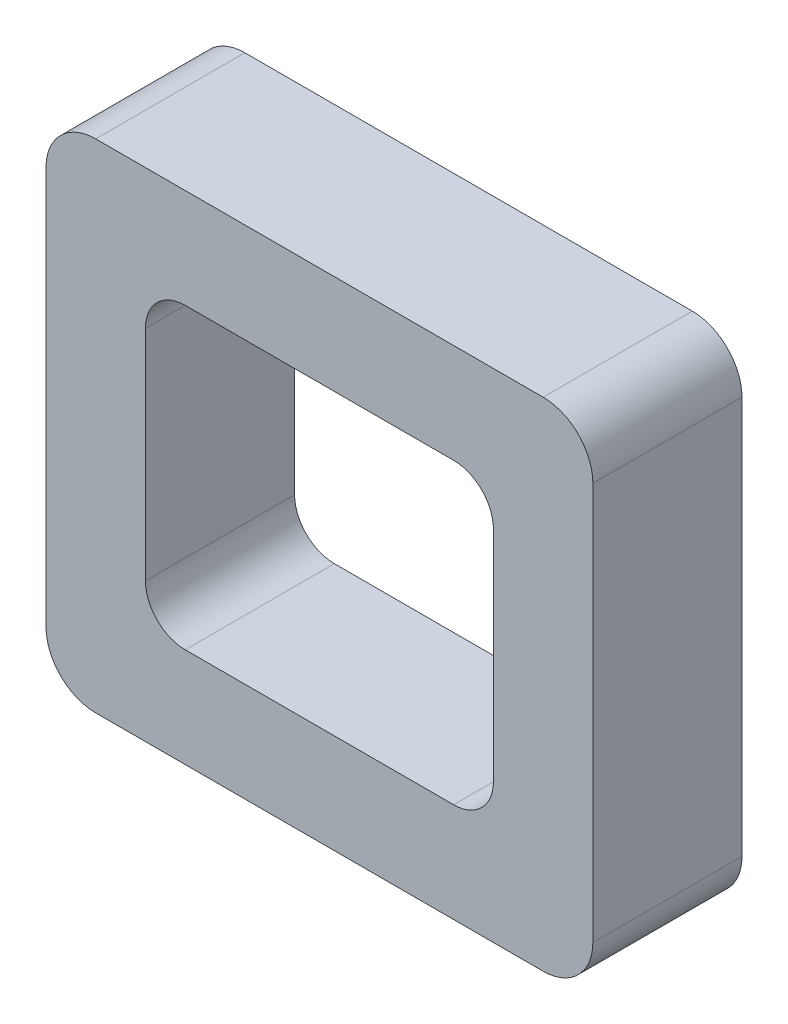
ISO-10303-21;
HEADER;
FILE_DESCRIPTION(('STEP AP214'),'2;1');
FILE_NAME('part.step','',(''),(''),'','','');
FILE_SCHEMA(('AUTOMOTIVE_DESIGN { 1 0 10303 214 1 1 1 1 }'));
ENDSEC;
DATA;
#1=APPLICATION_CONTEXT('core data for automotive mechanical design processes');
#2=APPLICATION_PROTOCOL_DEFINITION('international standard','automotive_design',2000,#1);
#3=PRODUCT_CONTEXT('',#1,'mechanical');
#4=PRODUCT('Part','Part','',(#3));
#5=PRODUCT_RELATED_PRODUCT_CATEGORY('part','',(#4));
#6=PRODUCT_DEFINITION_FORMATION('','',#4);
#7=PRODUCT_DEFINITION_CONTEXT('part definition',#1,'design');
#8=PRODUCT_DEFINITION('design','',#6,#7);
#9=PRODUCT_DEFINITION_SHAPE('','',#8);
#10=(LENGTH_UNIT() NAMED_UNIT(*) SI_UNIT(.MILLI.,.METRE.));
#11=(NAMED_UNIT(*) PLANE_ANGLE_UNIT() SI_UNIT($,.RADIAN.));
#12=(NAMED_UNIT(*) SI_UNIT($,.STERADIAN.) SOLID_ANGLE_UNIT());
#13=UNCERTAINTY_MEASURE_WITH_UNIT(LENGTH_MEASURE(1.E-05),#10,'distance_accuracy_value','');
#14=(GEOMETRIC_REPRESENTATION_CONTEXT(3) GLOBAL_UNCERTAINTY_ASSIGNED_CONTEXT((#13)) GLOBAL_UNIT_ASSIGNED_CONTEXT((#10,
#11,#12)) REPRESENTATION_CONTEXT('',''));
#15=CARTESIAN_POINT('',(0.,0.,0.));
#16=DIRECTION('',(0.,0.,1.));
#17=DIRECTION('',(1.,0.,0.));
#18=AXIS2_PLACEMENT_3D('',#15,#16,#17);
#19=CARTESIAN_POINT('',(-6.42551910571689,-2.12838242971782,3.));
#20=DIRECTION('',(0.,0.,-1.));
#21=DIRECTION('',(-1.,0.,0.));
#22=AXIS2_PLACEMENT_3D('',#19,#20,#21);
#23=CYLINDRICAL_SURFACE('',#22,1.);
#24=CARTESIAN_POINT('',(-6.42551910571689,-2.12838242971782,0.));
#25=DIRECTION('',(0.,0.,1.));
#26=DIRECTION('',(1.,0.,0.));
#27=AXIS2_PLACEMENT_3D('',#24,#25,#26);
#28=CIRCLE('',#27,1.);
#29=CARTESIAN_POINT('',(-7.42551910571689,-2.12838242971782,0.));
#30=VERTEX_POINT('',#29);
#31=CARTESIAN_POINT('',(-6.42551910571689,-3.12838242971782,0.));
#32=VERTEX_POINT('',#31);
#33=EDGE_CURVE('E210',#30,#32,#28,.T.);
#34=ORIENTED_EDGE('',*,*,#33,.T.);
#35=DIRECTION('',(0.,0.,-1.));
#36=VECTOR('',#35,1.);
#37=CARTESIAN_POINT('',(-6.42551910571689,-3.12838242971782,3.));
#38=LINE('',#37,#36);
#39=CARTESIAN_POINT('',(-6.42551910571689,-3.12838242971782,3.));
#40=VERTEX_POINT('',#39);
#41=EDGE_CURVE('E11',#40,#32,#38,.T.);
#42=ORIENTED_EDGE('',*,*,#41,.F.);
#43=CARTESIAN_POINT('',(-6.42551910571689,-2.12838242971782,3.));
#44=DIRECTION('',(0.,0.,1.));
#45=DIRECTION('',(1.,0.,0.));
#46=AXIS2_PLACEMENT_3D('',#43,#44,#45);
#47=CIRCLE('',#46,1.);
#48=CARTESIAN_POINT('',(-7.42551910571689,-2.12838242971782,3.));
#49=VERTEX_POINT('',#48);
#50=EDGE_CURVE('E222',#49,#40,#47,.T.);
#51=ORIENTED_EDGE('',*,*,#50,.F.);
#52=DIRECTION('',(0.,0.,-1.));
#53=VECTOR('',#52,1.);
#54=CARTESIAN_POINT('',(-7.42551910571689,-2.12838242971782,3.));
#55=LINE('',#54,#53);
#56=EDGE_CURVE('E240',#49,#30,#55,.T.);
#57=ORIENTED_EDGE('',*,*,#56,.T.);
#58=EDGE_LOOP('',(#34,#42,#51,#57));
#59=FACE_BOUND('',#58,.T.);
#60=ADVANCED_FACE('F41',(#59),#23,.T.);
#61=CARTESIAN_POINT('',(-6.42551910571689,-3.12838242971782,3.));
#62=DIRECTION('',(0.,1.,0.));
#63=DIRECTION('',(0.,0.,1.));
#64=AXIS2_PLACEMENT_3D('',#61,#62,#63);
#65=PLANE('',#64);
#66=DIRECTION('',(1.,0.,0.));
#67=VECTOR('',#66,1.);
#68=CARTESIAN_POINT('',(-6.42551910571689,-3.12838242971782,0.));
#69=LINE('',#68,#67);
#70=CARTESIAN_POINT('',(2.57448089428311,-3.12838242971782,0.));
#71=VERTEX_POINT('',#70);
#72=EDGE_CURVE('E243',#32,#71,#69,.T.);
#73=ORIENTED_EDGE('',*,*,#72,.T.);
#74=DIRECTION('',(0.,0.,-1.));
#75=VECTOR('',#74,1.);
#76=CARTESIAN_POINT('',(2.57448089428311,-3.12838242971782,3.));
#77=LINE('',#76,#75);
#78=CARTESIAN_POINT('',(2.57448089428311,-3.12838242971782,3.));
#79=VERTEX_POINT('',#78);
#80=EDGE_CURVE('E48',#79,#71,#77,.T.);
#81=ORIENTED_EDGE('',*,*,#80,.F.);
#82=DIRECTION('',(1.,0.,0.));
#83=VECTOR('',#82,1.);
#84=CARTESIAN_POINT('',(-6.42551910571689,-3.12838242971782,3.));
#85=LINE('',#84,#83);
#86=EDGE_CURVE('E225',#40,#79,#85,.T.);
#87=ORIENTED_EDGE('',*,*,#86,.F.);
#88=ORIENTED_EDGE('',*,*,#41,.T.);
#89=EDGE_LOOP('',(#73,#81,#87,#88));
#90=FACE_BOUND('',#89,.T.);
#91=ADVANCED_FACE('F298',(#90),#65,.F.);
#92=CARTESIAN_POINT('',(2.57448089428311,-2.12838242971782,3.));
#93=DIRECTION('',(0.,0.,-1.));
#94=DIRECTION('',(-1.,0.,0.));
#95=AXIS2_PLACEMENT_3D('',#92,#93,#94);
#96=CYLINDRICAL_SURFACE('',#95,1.);
#97=CARTESIAN_POINT('',(2.57448089428311,-2.12838242971782,0.));
#98=DIRECTION('',(0.,0.,1.));
#99=DIRECTION('',(1.,0.,0.));
#100=AXIS2_PLACEMENT_3D('',#97,#98,#99);
#101=CIRCLE('',#100,1.);
#102=CARTESIAN_POINT('',(3.57448089428311,-2.12838242971782,0.));
#103=VERTEX_POINT('',#102);
#104=EDGE_CURVE('E245',#71,#103,#101,.T.);
#105=ORIENTED_EDGE('',*,*,#104,.T.);
#106=DIRECTION('',(0.,0.,-1.));
#107=VECTOR('',#106,1.);
#108=CARTESIAN_POINT('',(3.57448089428311,-2.12838242971782,3.));
#109=LINE('',#108,#107);
#110=CARTESIAN_POINT('',(3.57448089428311,-2.12838242971782,3.));
#111=VERTEX_POINT('',#110);
#112=EDGE_CURVE('E270',#111,#103,#109,.T.);
#113=ORIENTED_EDGE('',*,*,#112,.F.);
#114=CARTESIAN_POINT('',(2.57448089428311,-2.12838242971782,3.));
#115=DIRECTION('',(0.,0.,1.));
#116=DIRECTION('',(1.,0.,0.));
#117=AXIS2_PLACEMENT_3D('',#114,#115,#116);
#118=CIRCLE('',#117,1.);
#119=EDGE_CURVE('E228',#79,#111,#118,.T.);
#120=ORIENTED_EDGE('',*,*,#119,.F.);
#121=ORIENTED_EDGE('',*,*,#80,.T.);
#122=EDGE_LOOP('',(#105,#113,#120,#121));
#123=FACE_BOUND('',#122,.T.);
#124=ADVANCED_FACE('F277',(#123),#96,.T.);
#125=CARTESIAN_POINT('',(3.57448089428311,5.87161757028218,3.));
#126=DIRECTION('',(-1.,0.,0.));
#127=DIRECTION('',(0.,-1.,0.));
#128=AXIS2_PLACEMENT_3D('',#125,#126,#127);
#129=PLANE('',#128);
#130=DIRECTION('',(0.,1.,0.));
#131=VECTOR('',#130,1.);
#132=CARTESIAN_POINT('',(3.57448089428311,5.87161757028218,0.));
#133=LINE('',#132,#131);
#134=CARTESIAN_POINT('',(3.57448089428311,5.87161757028218,0.));
#135=VERTEX_POINT('',#134);
#136=EDGE_CURVE('E247',#103,#135,#133,.T.);
#137=ORIENTED_EDGE('',*,*,#136,.T.);
#138=DIRECTION('',(0.,0.,-1.));
#139=VECTOR('',#138,1.);
#140=CARTESIAN_POINT('',(3.57448089428311,5.87161757028218,3.));
#141=LINE('',#140,#139);
#142=CARTESIAN_POINT('',(3.57448089428311,5.87161757028218,3.));
#143=VERTEX_POINT('',#142);
#144=EDGE_CURVE('E267',#143,#135,#141,.T.);
#145=ORIENTED_EDGE('',*,*,#144,.F.);
#146=DIRECTION('',(0.,1.,0.));
#147=VECTOR('',#146,1.);
#148=CARTESIAN_POINT('',(3.57448089428311,5.87161757028218,3.));
#149=LINE('',#148,#147);
#150=EDGE_CURVE('E230',#111,#143,#149,.T.);
#151=ORIENTED_EDGE('',*,*,#150,.F.);
#152=ORIENTED_EDGE('',*,*,#112,.T.);
#153=EDGE_LOOP('',(#137,#145,#151,#152));
#154=FACE_BOUND('',#153,.T.);
#155=ADVANCED_FACE('F288',(#154),#129,.F.);
#156=CARTESIAN_POINT('',(2.57448089428311,5.87161757028218,3.));
#157=DIRECTION('',(0.,0.,-1.));
#158=DIRECTION('',(-1.,0.,0.));
#159=AXIS2_PLACEMENT_3D('',#156,#157,#158);
#160=CYLINDRICAL_SURFACE('',#159,1.);
#161=CARTESIAN_POINT('',(2.57448089428311,5.87161757028218,0.));
#162=DIRECTION('',(0.,0.,1.));
#163=DIRECTION('',(-1.,0.,0.));
#164=AXIS2_PLACEMENT_3D('',#161,#162,#163);
#165=CIRCLE('',#164,1.);
#166=CARTESIAN_POINT('',(2.57448089428311,6.87161757028218,0.));
#167=VERTEX_POINT('',#166);
#168=EDGE_CURVE('E249',#135,#167,#165,.T.);
#169=ORIENTED_EDGE('',*,*,#168,.T.);
#170=DIRECTION('',(0.,0.,-1.));
#171=VECTOR('',#170,1.);
#172=CARTESIAN_POINT('',(2.57448089428311,6.87161757028218,3.));
#173=LINE('',#172,#171);
#174=CARTESIAN_POINT('',(2.57448089428311,6.87161757028218,3.));
#175=VERTEX_POINT('',#174);
#176=EDGE_CURVE('E264',#175,#167,#173,.T.);
#177=ORIENTED_EDGE('',*,*,#176,.F.);
#178=CARTESIAN_POINT('',(2.57448089428311,5.87161757028218,3.));
#179=DIRECTION('',(0.,0.,1.));
#180=DIRECTION('',(-1.,0.,0.));
#181=AXIS2_PLACEMENT_3D('',#178,#179,#180);
#182=CIRCLE('',#181,1.);
#183=EDGE_CURVE('E232',#143,#175,#182,.T.);
#184=ORIENTED_EDGE('',*,*,#183,.F.);
#185=ORIENTED_EDGE('',*,*,#144,.T.);
#186=EDGE_LOOP('',(#169,#177,#184,#185));
#187=FACE_BOUND('',#186,.T.);
#188=ADVANCED_FACE('F292',(#187),#160,.T.);
#189=CARTESIAN_POINT('',(-6.42551910571688,6.87161757028218,3.));
#190=DIRECTION('',(0.,-1.,0.));
#191=DIRECTION('',(0.,0.,-1.));
#192=AXIS2_PLACEMENT_3D('',#189,#190,#191);
#193=PLANE('',#192);
#194=DIRECTION('',(-1.,0.,0.));
#195=VECTOR('',#194,1.);
#196=CARTESIAN_POINT('',(-6.42551910571688,6.87161757028218,0.));
#197=LINE('',#196,#195);
#198=CARTESIAN_POINT('',(-6.42551910571688,6.87161757028218,0.));
#199=VERTEX_POINT('',#198);
#200=EDGE_CURVE('E251',#167,#199,#197,.T.);
#201=ORIENTED_EDGE('',*,*,#200,.T.);
#202=DIRECTION('',(0.,0.,-1.));
#203=VECTOR('',#202,1.);
#204=CARTESIAN_POINT('',(-6.42551910571688,6.87161757028218,3.));
#205=LINE('',#204,#203);
#206=CARTESIAN_POINT('',(-6.42551910571688,6.87161757028218,3.));
#207=VERTEX_POINT('',#206);
#208=EDGE_CURVE('E261',#207,#199,#205,.T.);
#209=ORIENTED_EDGE('',*,*,#208,.F.);
#210=DIRECTION('',(-1.,0.,0.));
#211=VECTOR('',#210,1.);
#212=CARTESIAN_POINT('',(-6.42551910571688,6.87161757028218,3.));
#213=LINE('',#212,#211);
#214=EDGE_CURVE('E234',#175,#207,#213,.T.);
#215=ORIENTED_EDGE('',*,*,#214,.F.);
#216=ORIENTED_EDGE('',*,*,#176,.T.);
#217=EDGE_LOOP('',(#201,#209,#215,#216));
#218=FACE_BOUND('',#217,.T.);
#219=ADVANCED_FACE('F311',(#218),#193,.F.);
#220=CARTESIAN_POINT('',(-6.42551910571689,5.87161757028218,3.));
#221=DIRECTION('',(0.,0.,-1.));
#222=DIRECTION('',(-1.,0.,0.));
#223=AXIS2_PLACEMENT_3D('',#220,#221,#222);
#224=CYLINDRICAL_SURFACE('',#223,1.);
#225=CARTESIAN_POINT('',(-6.42551910571689,5.87161757028218,0.));
#226=DIRECTION('',(0.,0.,1.));
#227=DIRECTION('',(1.,0.,0.));
#228=AXIS2_PLACEMENT_3D('',#225,#226,#227);
#229=CIRCLE('',#228,1.);
#230=CARTESIAN_POINT('',(-7.42551910571689,5.87161757028217,0.));
#231=VERTEX_POINT('',#230);
#232=EDGE_CURVE('E253',#199,#231,#229,.T.);
#233=ORIENTED_EDGE('',*,*,#232,.T.);
#234=DIRECTION('',(0.,0.,-1.));
#235=VECTOR('',#234,1.);
#236=CARTESIAN_POINT('',(-7.42551910571689,5.87161757028217,3.));
#237=LINE('',#236,#235);
#238=CARTESIAN_POINT('',(-7.42551910571689,5.87161757028217,3.));
#239=VERTEX_POINT('',#238);
#240=EDGE_CURVE('E258',#239,#231,#237,.T.);
#241=ORIENTED_EDGE('',*,*,#240,.F.);
#242=CARTESIAN_POINT('',(-6.42551910571689,5.87161757028218,3.));
#243=DIRECTION('',(0.,0.,1.));
#244=DIRECTION('',(1.,0.,0.));
#245=AXIS2_PLACEMENT_3D('',#242,#243,#244);
#246=CIRCLE('',#245,1.);
#247=EDGE_CURVE('E236',#207,#239,#246,.T.);
#248=ORIENTED_EDGE('',*,*,#247,.F.);
#249=ORIENTED_EDGE('',*,*,#208,.T.);
#250=EDGE_LOOP('',(#233,#241,#248,#249));
#251=FACE_BOUND('',#250,.T.);
#252=ADVANCED_FACE('F309',(#251),#224,.T.);
#253=CARTESIAN_POINT('',(-7.42551910571689,5.87161757028217,3.));
#254=DIRECTION('',(1.,0.,0.));
#255=DIRECTION('',(0.,0.,-1.));
#256=AXIS2_PLACEMENT_3D('',#253,#254,#255);
#257=PLANE('',#256);
#258=DIRECTION('',(0.,-1.,0.));
#259=VECTOR('',#258,1.);
#260=CARTESIAN_POINT('',(-7.42551910571689,5.87161757028217,0.));
#261=LINE('',#260,#259);
#262=EDGE_CURVE('E226',#231,#30,#261,.T.);
#263=ORIENTED_EDGE('',*,*,#262,.T.);
#264=ORIENTED_EDGE('',*,*,#56,.F.);
#265=DIRECTION('',(0.,-1.,0.));
#266=VECTOR('',#265,1.);
#267=CARTESIAN_POINT('',(-7.42551910571689,5.87161757028217,3.));
#268=LINE('',#267,#266);
#269=EDGE_CURVE('E238',#239,#49,#268,.T.);
#270=ORIENTED_EDGE('',*,*,#269,.F.);
#271=ORIENTED_EDGE('',*,*,#240,.T.);
#272=EDGE_LOOP('',(#263,#264,#270,#271));
#273=FACE_BOUND('',#272,.T.);
#274=ADVANCED_FACE('F304',(#273),#257,.F.);
#275=CARTESIAN_POINT('',(-6.42551910571689,-2.12838242971782,3.));
#276=DIRECTION('',(0.,0.,1.));
#277=DIRECTION('',(1.,0.,0.));
#278=AXIS2_PLACEMENT_3D('',#275,#276,#277);
#279=PLANE('',#278);
#280=CARTESIAN_POINT('',(0.77448089428311,-0.328382429717821,3.));
#281=DIRECTION('',(0.,0.,-1.));
#282=DIRECTION('',(-1.,0.,0.));
#283=AXIS2_PLACEMENT_3D('',#280,#281,#282);
#284=CIRCLE('',#283,0.8);
#285=CARTESIAN_POINT('',(1.57448089428311,-0.328382429717821,3.));
#286=VERTEX_POINT('',#285);
#287=CARTESIAN_POINT('',(0.77448089428311,-1.12838242971782,3.));
#288=VERTEX_POINT('',#287);
#289=EDGE_CURVE('E155',#286,#288,#284,.T.);
#290=ORIENTED_EDGE('',*,*,#289,.T.);
#291=DIRECTION('',(-1.,0.,0.));
#292=VECTOR('',#291,1.);
#293=CARTESIAN_POINT('',(0.77448089428311,-1.12838242971782,3.));
#294=LINE('',#293,#292);
#295=CARTESIAN_POINT('',(-4.62551910571689,-1.12838242971782,3.));
#296=VERTEX_POINT('',#295);
#297=EDGE_CURVE('E164',#288,#296,#294,.T.);
#298=ORIENTED_EDGE('',*,*,#297,.T.);
#299=CARTESIAN_POINT('',(-4.62551910571689,-0.328382429717821,3.));
#300=DIRECTION('',(0.,0.,-1.));
#301=DIRECTION('',(1.,0.,0.));
#302=AXIS2_PLACEMENT_3D('',#299,#300,#301);
#303=CIRCLE('',#302,0.8);
#304=CARTESIAN_POINT('',(-5.42551910571689,-0.328382429717821,3.));
#305=VERTEX_POINT('',#304);
#306=EDGE_CURVE('E55',#296,#305,#303,.T.);
#307=ORIENTED_EDGE('',*,*,#306,.T.);
#308=DIRECTION('',(0.,1.,0.));
#309=VECTOR('',#308,1.);
#310=CARTESIAN_POINT('',(-5.42551910571689,-0.328382429717821,3.));
#311=LINE('',#310,#309);
#312=CARTESIAN_POINT('',(-5.42551910571689,4.07161757028218,3.));
#313=VERTEX_POINT('',#312);
#314=EDGE_CURVE('E179',#305,#313,#311,.T.);
#315=ORIENTED_EDGE('',*,*,#314,.T.);
#316=CARTESIAN_POINT('',(-4.62551910571689,4.07161757028218,3.));
#317=DIRECTION('',(0.,0.,-1.));
#318=DIRECTION('',(-1.,0.,0.));
#319=AXIS2_PLACEMENT_3D('',#316,#317,#318);
#320=CIRCLE('',#319,0.800000000000001);
#321=CARTESIAN_POINT('',(-4.62551910571689,4.87161757028218,3.));
#322=VERTEX_POINT('',#321);
#323=EDGE_CURVE('E182',#313,#322,#320,.T.);
#324=ORIENTED_EDGE('',*,*,#323,.T.);
#325=DIRECTION('',(1.,0.,0.));
#326=VECTOR('',#325,1.);
#327=CARTESIAN_POINT('',(-4.62551910571689,4.87161757028218,3.));
#328=LINE('',#327,#326);
#329=CARTESIAN_POINT('',(0.77448089428311,4.87161757028218,3.));
#330=VERTEX_POINT('',#329);
#331=EDGE_CURVE('E185',#322,#330,#328,.T.);
#332=ORIENTED_EDGE('',*,*,#331,.T.);
#333=CARTESIAN_POINT('',(0.77448089428311,4.07161757028218,3.));
#334=DIRECTION('',(0.,0.,-1.));
#335=DIRECTION('',(-1.,0.,0.));
#336=AXIS2_PLACEMENT_3D('',#333,#334,#335);
#337=CIRCLE('',#336,0.8);
#338=CARTESIAN_POINT('',(1.57448089428311,4.07161757028218,3.));
#339=VERTEX_POINT('',#338);
#340=EDGE_CURVE('E188',#330,#339,#337,.T.);
#341=ORIENTED_EDGE('',*,*,#340,.T.);
#342=DIRECTION('',(0.,-1.,0.));
#343=VECTOR('',#342,1.);
#344=CARTESIAN_POINT('',(1.57448089428311,4.07161757028218,3.));
#345=LINE('',#344,#343);
#346=EDGE_CURVE('E161',#339,#286,#345,.T.);
#347=ORIENTED_EDGE('',*,*,#346,.T.);
#348=EDGE_LOOP('',(#290,#298,#307,#315,#324,#332,#341,#347));
#349=FACE_BOUND('',#348,.T.);
#350=ORIENTED_EDGE('',*,*,#50,.T.);
#351=ORIENTED_EDGE('',*,*,#86,.T.);
#352=ORIENTED_EDGE('',*,*,#119,.T.);
#353=ORIENTED_EDGE('',*,*,#150,.T.);
#354=ORIENTED_EDGE('',*,*,#183,.T.);
#355=ORIENTED_EDGE('',*,*,#214,.T.);
#356=ORIENTED_EDGE('',*,*,#247,.T.);
#357=ORIENTED_EDGE('',*,*,#269,.T.);
#358=EDGE_LOOP('',(#350,#351,#352,#353,#354,#355,#356,#357));
#359=FACE_BOUND('',#358,.T.);
#360=ADVANCED_FACE('F168',(#349,#359),#279,.T.);
#361=CARTESIAN_POINT('',(-6.42551910571689,-2.12838242971782,0.));
#362=DIRECTION('',(0.,0.,1.));
#363=DIRECTION('',(1.,0.,0.));
#364=AXIS2_PLACEMENT_3D('',#361,#362,#363);
#365=PLANE('',#364);
#366=DIRECTION('',(-1.,0.,0.));
#367=VECTOR('',#366,1.);
#368=CARTESIAN_POINT('',(0.77448089428311,-1.12838242971782,0.));
#369=LINE('',#368,#367);
#370=CARTESIAN_POINT('',(0.77448089428311,-1.12838242971782,0.));
#371=VERTEX_POINT('',#370);
#372=CARTESIAN_POINT('',(-4.62551910571689,-1.12838242971782,0.));
#373=VERTEX_POINT('',#372);
#374=EDGE_CURVE('E192',#371,#373,#369,.T.);
#375=ORIENTED_EDGE('',*,*,#374,.F.);
#376=CARTESIAN_POINT('',(0.77448089428311,-0.328382429717821,0.));
#377=DIRECTION('',(0.,0.,-1.));
#378=DIRECTION('',(-1.,0.,0.));
#379=AXIS2_PLACEMENT_3D('',#376,#377,#378);
#380=CIRCLE('',#379,0.8);
#381=CARTESIAN_POINT('',(1.57448089428311,-0.328382429717821,0.));
#382=VERTEX_POINT('',#381);
#383=EDGE_CURVE('E63',#382,#371,#380,.T.);
#384=ORIENTED_EDGE('',*,*,#383,.F.);
#385=DIRECTION('',(0.,-1.,0.));
#386=VECTOR('',#385,1.);
#387=CARTESIAN_POINT('',(1.57448089428311,4.07161757028218,0.));
#388=LINE('',#387,#386);
#389=CARTESIAN_POINT('',(1.57448089428311,4.07161757028218,0.));
#390=VERTEX_POINT('',#389);
#391=EDGE_CURVE('E172',#390,#382,#388,.T.);
#392=ORIENTED_EDGE('',*,*,#391,.F.);
#393=CARTESIAN_POINT('',(0.77448089428311,4.07161757028218,0.));
#394=DIRECTION('',(0.,0.,-1.));
#395=DIRECTION('',(-1.,0.,0.));
#396=AXIS2_PLACEMENT_3D('',#393,#394,#395);
#397=CIRCLE('',#396,0.8);
#398=CARTESIAN_POINT('',(0.77448089428311,4.87161757028218,0.));
#399=VERTEX_POINT('',#398);
#400=EDGE_CURVE('E175',#399,#390,#397,.T.);
#401=ORIENTED_EDGE('',*,*,#400,.F.);
#402=DIRECTION('',(1.,0.,0.));
#403=VECTOR('',#402,1.);
#404=CARTESIAN_POINT('',(-4.62551910571689,4.87161757028218,0.));
#405=LINE('',#404,#403);
#406=CARTESIAN_POINT('',(-4.62551910571689,4.87161757028218,0.));
#407=VERTEX_POINT('',#406);
#408=EDGE_CURVE('E203',#407,#399,#405,.T.);
#409=ORIENTED_EDGE('',*,*,#408,.F.);
#410=CARTESIAN_POINT('',(-4.62551910571689,4.07161757028218,0.));
#411=DIRECTION('',(0.,0.,-1.));
#412=DIRECTION('',(-1.,0.,0.));
#413=AXIS2_PLACEMENT_3D('',#410,#411,#412);
#414=CIRCLE('',#413,0.800000000000001);
#415=CARTESIAN_POINT('',(-5.42551910571689,4.07161757028218,0.));
#416=VERTEX_POINT('',#415);
#417=EDGE_CURVE('E200',#416,#407,#414,.T.);
#418=ORIENTED_EDGE('',*,*,#417,.F.);
#419=DIRECTION('',(0.,1.,0.));
#420=VECTOR('',#419,1.);
#421=CARTESIAN_POINT('',(-5.42551910571689,-0.328382429717821,0.));
#422=LINE('',#421,#420);
#423=CARTESIAN_POINT('',(-5.42551910571689,-0.328382429717821,0.));
#424=VERTEX_POINT('',#423);
#425=EDGE_CURVE('E197',#424,#416,#422,.T.);
#426=ORIENTED_EDGE('',*,*,#425,.F.);
#427=CARTESIAN_POINT('',(-4.62551910571689,-0.328382429717821,0.));
#428=DIRECTION('',(0.,0.,-1.));
#429=DIRECTION('',(1.,0.,0.));
#430=AXIS2_PLACEMENT_3D('',#427,#428,#429);
#431=CIRCLE('',#430,0.8);
#432=EDGE_CURVE('E194',#373,#424,#431,.T.);
#433=ORIENTED_EDGE('',*,*,#432,.F.);
#434=EDGE_LOOP('',(#375,#384,#392,#401,#409,#418,#426,#433));
#435=FACE_BOUND('',#434,.T.);
#436=ORIENTED_EDGE('',*,*,#33,.F.);
#437=ORIENTED_EDGE('',*,*,#262,.F.);
#438=ORIENTED_EDGE('',*,*,#232,.F.);
#439=ORIENTED_EDGE('',*,*,#200,.F.);
#440=ORIENTED_EDGE('',*,*,#168,.F.);
#441=ORIENTED_EDGE('',*,*,#136,.F.);
#442=ORIENTED_EDGE('',*,*,#104,.F.);
#443=ORIENTED_EDGE('',*,*,#72,.F.);
#444=EDGE_LOOP('',(#436,#437,#438,#439,#440,#441,#442,#443));
#445=FACE_BOUND('',#444,.T.);
#446=ADVANCED_FACE('F283',(#435,#445),#365,.F.);
#447=CARTESIAN_POINT('',(0.77448089428311,-0.328382429717821,3.));
#448=DIRECTION('',(0.,0.,-1.));
#449=DIRECTION('',(-1.,0.,0.));
#450=AXIS2_PLACEMENT_3D('',#447,#448,#449);
#451=CYLINDRICAL_SURFACE('',#450,0.8);
#452=ORIENTED_EDGE('',*,*,#383,.T.);
#453=DIRECTION('',(0.,0.,-1.));
#454=VECTOR('',#453,1.);
#455=CARTESIAN_POINT('',(0.77448089428311,-1.12838242971782,3.));
#456=LINE('',#455,#454);
#457=EDGE_CURVE('E151',#288,#371,#456,.T.);
#458=ORIENTED_EDGE('',*,*,#457,.F.);
#459=ORIENTED_EDGE('',*,*,#289,.F.);
#460=DIRECTION('',(0.,0.,-1.));
#461=VECTOR('',#460,1.);
#462=CARTESIAN_POINT('',(1.57448089428311,-0.328382429717821,3.));
#463=LINE('',#462,#461);
#464=EDGE_CURVE('E208',#286,#382,#463,.T.);
#465=ORIENTED_EDGE('',*,*,#464,.T.);
#466=EDGE_LOOP('',(#452,#458,#459,#465));
#467=FACE_BOUND('',#466,.T.);
#468=ADVANCED_FACE('F153',(#467),#451,.F.);
#469=CARTESIAN_POINT('',(1.57448089428311,4.07161757028218,3.));
#470=DIRECTION('',(1.,0.,0.));
#471=DIRECTION('',(0.,1.,0.));
#472=AXIS2_PLACEMENT_3D('',#469,#470,#471);
#473=PLANE('',#472);
#474=ORIENTED_EDGE('',*,*,#391,.T.);
#475=ORIENTED_EDGE('',*,*,#464,.F.);
#476=ORIENTED_EDGE('',*,*,#346,.F.);
#477=DIRECTION('',(0.,0.,-1.));
#478=VECTOR('',#477,1.);
#479=CARTESIAN_POINT('',(1.57448089428311,4.07161757028218,3.));
#480=LINE('',#479,#478);
#481=EDGE_CURVE('E211',#339,#390,#480,.T.);
#482=ORIENTED_EDGE('',*,*,#481,.T.);
#483=EDGE_LOOP('',(#474,#475,#476,#482));
#484=FACE_BOUND('',#483,.T.);
#485=ADVANCED_FACE('F384',(#484),#473,.F.);
#486=CARTESIAN_POINT('',(0.77448089428311,4.07161757028218,3.));
#487=DIRECTION('',(0.,0.,-1.));
#488=DIRECTION('',(-1.,0.,0.));
#489=AXIS2_PLACEMENT_3D('',#486,#487,#488);
#490=CYLINDRICAL_SURFACE('',#489,0.8);
#491=ORIENTED_EDGE('',*,*,#400,.T.);
#492=ORIENTED_EDGE('',*,*,#481,.F.);
#493=ORIENTED_EDGE('',*,*,#340,.F.);
#494=DIRECTION('',(0.,0.,-1.));
#495=VECTOR('',#494,1.);
#496=CARTESIAN_POINT('',(0.77448089428311,4.87161757028218,3.));
#497=LINE('',#496,#495);
#498=EDGE_CURVE('E213',#330,#399,#497,.T.);
#499=ORIENTED_EDGE('',*,*,#498,.T.);
#500=EDGE_LOOP('',(#491,#492,#493,#499));
#501=FACE_BOUND('',#500,.T.);
#502=ADVANCED_FACE('F393',(#501),#490,.F.);
#503=CARTESIAN_POINT('',(-4.62551910571689,4.87161757028218,3.));
#504=DIRECTION('',(0.,1.,0.));
#505=DIRECTION('',(0.,0.,1.));
#506=AXIS2_PLACEMENT_3D('',#503,#504,#505);
#507=PLANE('',#506);
#508=ORIENTED_EDGE('',*,*,#408,.T.);
#509=ORIENTED_EDGE('',*,*,#498,.F.);
#510=ORIENTED_EDGE('',*,*,#331,.F.);
#511=DIRECTION('',(0.,0.,-1.));
#512=VECTOR('',#511,1.);
#513=CARTESIAN_POINT('',(-4.62551910571689,4.87161757028218,3.));
#514=LINE('',#513,#512);
#515=EDGE_CURVE('E215',#322,#407,#514,.T.);
#516=ORIENTED_EDGE('',*,*,#515,.T.);
#517=EDGE_LOOP('',(#508,#509,#510,#516));
#518=FACE_BOUND('',#517,.T.);
#519=ADVANCED_FACE('F403',(#518),#507,.F.);
#520=CARTESIAN_POINT('',(-4.62551910571689,4.07161757028218,3.));
#521=DIRECTION('',(0.,0.,-1.));
#522=DIRECTION('',(-1.,0.,0.));
#523=AXIS2_PLACEMENT_3D('',#520,#521,#522);
#524=CYLINDRICAL_SURFACE('',#523,0.800000000000001);
#525=ORIENTED_EDGE('',*,*,#417,.T.);
#526=ORIENTED_EDGE('',*,*,#515,.F.);
#527=ORIENTED_EDGE('',*,*,#323,.F.);
#528=DIRECTION('',(0.,0.,-1.));
#529=VECTOR('',#528,1.);
#530=CARTESIAN_POINT('',(-5.42551910571689,4.07161757028218,3.));
#531=LINE('',#530,#529);
#532=EDGE_CURVE('E217',#313,#416,#531,.T.);
#533=ORIENTED_EDGE('',*,*,#532,.T.);
#534=EDGE_LOOP('',(#525,#526,#527,#533));
#535=FACE_BOUND('',#534,.T.);
#536=ADVANCED_FACE('F413',(#535),#524,.F.);
#537=CARTESIAN_POINT('',(-5.42551910571689,-0.328382429717821,3.));
#538=DIRECTION('',(-1.,0.,0.));
#539=DIRECTION('',(0.,-1.,0.));
#540=AXIS2_PLACEMENT_3D('',#537,#538,#539);
#541=PLANE('',#540);
#542=ORIENTED_EDGE('',*,*,#425,.T.);
#543=ORIENTED_EDGE('',*,*,#532,.F.);
#544=ORIENTED_EDGE('',*,*,#314,.F.);
#545=DIRECTION('',(0.,0.,-1.));
#546=VECTOR('',#545,1.);
#547=CARTESIAN_POINT('',(-5.42551910571689,-0.328382429717821,3.));
#548=LINE('',#547,#546);
#549=EDGE_CURVE('E219',#305,#424,#548,.T.);
#550=ORIENTED_EDGE('',*,*,#549,.T.);
#551=EDGE_LOOP('',(#542,#543,#544,#550));
#552=FACE_BOUND('',#551,.T.);
#553=ADVANCED_FACE('F423',(#552),#541,.F.);
#554=CARTESIAN_POINT('',(-4.62551910571689,-0.328382429717821,3.));
#555=DIRECTION('',(0.,0.,-1.));
#556=DIRECTION('',(-1.,0.,0.));
#557=AXIS2_PLACEMENT_3D('',#554,#555,#556);
#558=CYLINDRICAL_SURFACE('',#557,0.8);
#559=ORIENTED_EDGE('',*,*,#432,.T.);
#560=ORIENTED_EDGE('',*,*,#549,.F.);
#561=ORIENTED_EDGE('',*,*,#306,.F.);
#562=DIRECTION('',(0.,0.,-1.));
#563=VECTOR('',#562,1.);
#564=CARTESIAN_POINT('',(-4.62551910571689,-1.12838242971782,3.));
#565=LINE('',#564,#563);
#566=EDGE_CURVE('E160',#296,#373,#565,.T.);
#567=ORIENTED_EDGE('',*,*,#566,.T.);
#568=EDGE_LOOP('',(#559,#560,#561,#567));
#569=FACE_BOUND('',#568,.T.);
#570=ADVANCED_FACE('F433',(#569),#558,.F.);
#571=CARTESIAN_POINT('',(0.77448089428311,-1.12838242971782,3.));
#572=DIRECTION('',(0.,-1.,0.));
#573=DIRECTION('',(0.,0.,-1.));
#574=AXIS2_PLACEMENT_3D('',#571,#572,#573);
#575=PLANE('',#574);
#576=ORIENTED_EDGE('',*,*,#374,.T.);
#577=ORIENTED_EDGE('',*,*,#566,.F.);
#578=ORIENTED_EDGE('',*,*,#297,.F.);
#579=ORIENTED_EDGE('',*,*,#457,.T.);
#580=EDGE_LOOP('',(#576,#577,#578,#579));
#581=FACE_BOUND('',#580,.T.);
#582=ADVANCED_FACE('F165',(#581),#575,.F.);
#583=CLOSED_SHELL('',(#60,#91,#124,#155,#188,#219,#252,#274,#360,#446,#468,#485,#502,#519,#536,
#553,#570,#582));
#584=MANIFOLD_SOLID_BREP('B2',#583);
#585=ADVANCED_BREP_SHAPE_REPRESENTATION('',(#18,#584),#14);
#586=SHAPE_DEFINITION_REPRESENTATION(#9,#585);
ENDSEC;
END-ISO-10303-21;
